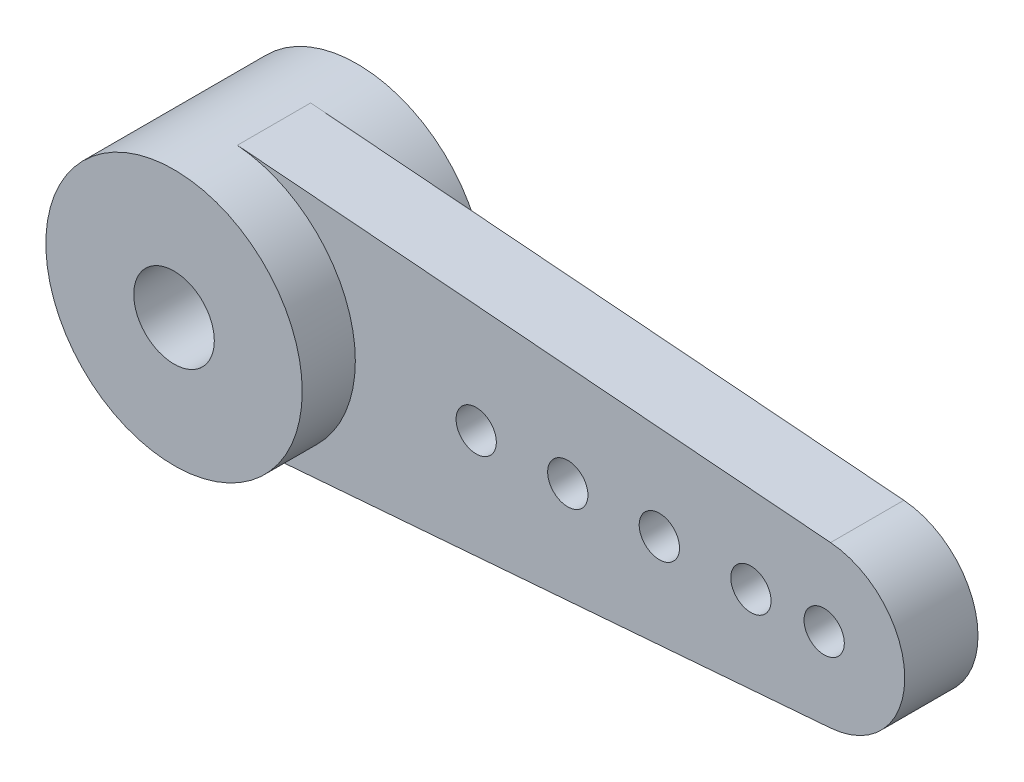
ISO-10303-21;
HEADER;
FILE_DESCRIPTION(('STEP AP214'),'2;1');
FILE_NAME('part.step','',(''),(''),'','','');
FILE_SCHEMA(('AUTOMOTIVE_DESIGN { 1 0 10303 214 1 1 1 1 }'));
ENDSEC;
DATA;
#1=APPLICATION_CONTEXT('core data for automotive mechanical design processes');
#2=APPLICATION_PROTOCOL_DEFINITION('international standard','automotive_design',2000,#1);
#3=PRODUCT_CONTEXT('',#1,'mechanical');
#4=PRODUCT('Part','Part','',(#3));
#5=PRODUCT_RELATED_PRODUCT_CATEGORY('part','',(#4));
#6=PRODUCT_DEFINITION_FORMATION('','',#4);
#7=PRODUCT_DEFINITION_CONTEXT('part definition',#1,'design');
#8=PRODUCT_DEFINITION('design','',#6,#7);
#9=PRODUCT_DEFINITION_SHAPE('','',#8);
#10=(LENGTH_UNIT() NAMED_UNIT(*) SI_UNIT(.MILLI.,.METRE.));
#11=(NAMED_UNIT(*) PLANE_ANGLE_UNIT() SI_UNIT($,.RADIAN.));
#12=(NAMED_UNIT(*) SI_UNIT($,.STERADIAN.) SOLID_ANGLE_UNIT());
#13=UNCERTAINTY_MEASURE_WITH_UNIT(LENGTH_MEASURE(1.E-05),#10,'distance_accuracy_value','');
#14=(GEOMETRIC_REPRESENTATION_CONTEXT(3) GLOBAL_UNCERTAINTY_ASSIGNED_CONTEXT((#13)) GLOBAL_UNIT_ASSIGNED_CONTEXT((#10,
#11,#12)) REPRESENTATION_CONTEXT('',''));
#15=CARTESIAN_POINT('',(0.,0.,0.));
#16=DIRECTION('',(0.,0.,1.));
#17=DIRECTION('',(1.,0.,0.));
#18=AXIS2_PLACEMENT_3D('',#15,#16,#17);
#19=CARTESIAN_POINT('',(0.,0.,27.8));
#20=DIRECTION('',(0.,0.,1.));
#21=DIRECTION('',(1.,0.,0.));
#22=AXIS2_PLACEMENT_3D('',#19,#20,#21);
#23=CYLINDRICAL_SURFACE('',#22,1.1);
#24=CARTESIAN_POINT('',(0.,0.,33.3));
#25=DIRECTION('',(0.,0.,1.));
#26=DIRECTION('',(1.,0.,0.));
#27=AXIS2_PLACEMENT_3D('',#24,#25,#26);
#28=CIRCLE('',#27,1.1);
#29=CARTESIAN_POINT('',(1.1,0.,33.3));
#30=VERTEX_POINT('',#29);
#31=EDGE_CURVE('E10',#30,#30,#28,.T.);
#32=ORIENTED_EDGE('',*,*,#31,.T.);
#33=EDGE_LOOP('',(#32));
#34=FACE_BOUND('',#33,.T.);
#35=CARTESIAN_POINT('',(0.,0.,28.3));
#36=DIRECTION('',(0.,0.,1.));
#37=DIRECTION('',(1.,0.,0.));
#38=AXIS2_PLACEMENT_3D('',#35,#36,#37);
#39=CIRCLE('',#38,1.1);
#40=CARTESIAN_POINT('',(1.1,0.,28.3));
#41=VERTEX_POINT('',#40);
#42=EDGE_CURVE('E125',#41,#41,#39,.T.);
#43=ORIENTED_EDGE('',*,*,#42,.F.);
#44=EDGE_LOOP('',(#43));
#45=FACE_BOUND('',#44,.T.);
#46=ADVANCED_FACE('F16',(#34,#45),#23,.F.);
#47=CARTESIAN_POINT('',(16.3,0.,29.35));
#48=DIRECTION('',(0.,0.,-1.));
#49=DIRECTION('',(1.,0.,0.));
#50=AXIS2_PLACEMENT_3D('',#47,#48,#49);
#51=CYLINDRICAL_SURFACE('',#50,0.55);
#52=CARTESIAN_POINT('',(16.3,0.,31.85));
#53=DIRECTION('',(0.,0.,-1.));
#54=DIRECTION('',(1.,0.,0.));
#55=AXIS2_PLACEMENT_3D('',#52,#53,#54);
#56=CIRCLE('',#55,0.55);
#57=CARTESIAN_POINT('',(16.85,0.,31.85));
#58=VERTEX_POINT('',#57);
#59=EDGE_CURVE('E88',#58,#58,#56,.T.);
#60=ORIENTED_EDGE('',*,*,#59,.F.);
#61=EDGE_LOOP('',(#60));
#62=FACE_BOUND('',#61,.T.);
#63=CARTESIAN_POINT('',(16.3,0.,29.85));
#64=DIRECTION('',(0.,0.,-1.));
#65=DIRECTION('',(1.,0.,0.));
#66=AXIS2_PLACEMENT_3D('',#63,#64,#65);
#67=CIRCLE('',#66,0.55);
#68=CARTESIAN_POINT('',(16.85,0.,29.85));
#69=VERTEX_POINT('',#68);
#70=EDGE_CURVE('E172',#69,#69,#67,.T.);
#71=ORIENTED_EDGE('',*,*,#70,.T.);
#72=EDGE_LOOP('',(#71));
#73=FACE_BOUND('',#72,.T.);
#74=ADVANCED_FACE('F185',(#62,#73),#51,.F.);
#75=CARTESIAN_POINT('',(14.3,0.,29.35));
#76=DIRECTION('',(0.,0.,-1.));
#77=DIRECTION('',(1.,0.,0.));
#78=AXIS2_PLACEMENT_3D('',#75,#76,#77);
#79=CYLINDRICAL_SURFACE('',#78,0.55);
#80=CARTESIAN_POINT('',(14.3,0.,31.85));
#81=DIRECTION('',(0.,0.,-1.));
#82=DIRECTION('',(1.,0.,0.));
#83=AXIS2_PLACEMENT_3D('',#80,#81,#82);
#84=CIRCLE('',#83,0.55);
#85=CARTESIAN_POINT('',(14.85,0.,31.85));
#86=VERTEX_POINT('',#85);
#87=EDGE_CURVE('E116',#86,#86,#84,.T.);
#88=ORIENTED_EDGE('',*,*,#87,.F.);
#89=EDGE_LOOP('',(#88));
#90=FACE_BOUND('',#89,.T.);
#91=CARTESIAN_POINT('',(14.3,0.,29.85));
#92=DIRECTION('',(0.,0.,-1.));
#93=DIRECTION('',(1.,0.,0.));
#94=AXIS2_PLACEMENT_3D('',#91,#92,#93);
#95=CIRCLE('',#94,0.55);
#96=CARTESIAN_POINT('',(14.85,0.,29.85));
#97=VERTEX_POINT('',#96);
#98=EDGE_CURVE('E143',#97,#97,#95,.T.);
#99=ORIENTED_EDGE('',*,*,#98,.T.);
#100=EDGE_LOOP('',(#99));
#101=FACE_BOUND('',#100,.T.);
#102=ADVANCED_FACE('F192',(#90,#101),#79,.F.);
#103=CARTESIAN_POINT('',(11.8,0.,29.35));
#104=DIRECTION('',(0.,0.,-1.));
#105=DIRECTION('',(1.,0.,0.));
#106=AXIS2_PLACEMENT_3D('',#103,#104,#105);
#107=CYLINDRICAL_SURFACE('',#106,0.55);
#108=CARTESIAN_POINT('',(11.8,0.,31.85));
#109=DIRECTION('',(0.,0.,-1.));
#110=DIRECTION('',(1.,0.,0.));
#111=AXIS2_PLACEMENT_3D('',#108,#109,#110);
#112=CIRCLE('',#111,0.55);
#113=CARTESIAN_POINT('',(12.35,0.,31.85));
#114=VERTEX_POINT('',#113);
#115=EDGE_CURVE('E113',#114,#114,#112,.T.);
#116=ORIENTED_EDGE('',*,*,#115,.F.);
#117=EDGE_LOOP('',(#116));
#118=FACE_BOUND('',#117,.T.);
#119=CARTESIAN_POINT('',(11.8,0.,29.85));
#120=DIRECTION('',(0.,0.,-1.));
#121=DIRECTION('',(1.,0.,0.));
#122=AXIS2_PLACEMENT_3D('',#119,#120,#121);
#123=CIRCLE('',#122,0.55);
#124=CARTESIAN_POINT('',(12.35,0.,29.85));
#125=VERTEX_POINT('',#124);
#126=EDGE_CURVE('E139',#125,#125,#123,.T.);
#127=ORIENTED_EDGE('',*,*,#126,.T.);
#128=EDGE_LOOP('',(#127));
#129=FACE_BOUND('',#128,.T.);
#130=ADVANCED_FACE('F222',(#118,#129),#107,.F.);
#131=CARTESIAN_POINT('',(9.3,0.,29.35));
#132=DIRECTION('',(0.,0.,-1.));
#133=DIRECTION('',(1.,0.,0.));
#134=AXIS2_PLACEMENT_3D('',#131,#132,#133);
#135=CYLINDRICAL_SURFACE('',#134,0.55);
#136=CARTESIAN_POINT('',(9.3,0.,31.85));
#137=DIRECTION('',(0.,0.,-1.));
#138=DIRECTION('',(1.,0.,0.));
#139=AXIS2_PLACEMENT_3D('',#136,#137,#138);
#140=CIRCLE('',#139,0.55);
#141=CARTESIAN_POINT('',(9.85,0.,31.85));
#142=VERTEX_POINT('',#141);
#143=EDGE_CURVE('E117',#142,#142,#140,.T.);
#144=ORIENTED_EDGE('',*,*,#143,.F.);
#145=EDGE_LOOP('',(#144));
#146=FACE_BOUND('',#145,.T.);
#147=CARTESIAN_POINT('',(9.3,0.,29.85));
#148=DIRECTION('',(0.,0.,-1.));
#149=DIRECTION('',(1.,0.,0.));
#150=AXIS2_PLACEMENT_3D('',#147,#148,#149);
#151=CIRCLE('',#150,0.55);
#152=CARTESIAN_POINT('',(9.85,0.,29.85));
#153=VERTEX_POINT('',#152);
#154=EDGE_CURVE('E144',#153,#153,#151,.T.);
#155=ORIENTED_EDGE('',*,*,#154,.T.);
#156=EDGE_LOOP('',(#155));
#157=FACE_BOUND('',#156,.T.);
#158=ADVANCED_FACE('F231',(#146,#157),#135,.F.);
#159=CARTESIAN_POINT('',(6.8,0.,29.35));
#160=DIRECTION('',(0.,0.,-1.));
#161=DIRECTION('',(1.,0.,0.));
#162=AXIS2_PLACEMENT_3D('',#159,#160,#161);
#163=CYLINDRICAL_SURFACE('',#162,0.55);
#164=CARTESIAN_POINT('',(6.8,0.,31.85));
#165=DIRECTION('',(0.,0.,-1.));
#166=DIRECTION('',(1.,0.,0.));
#167=AXIS2_PLACEMENT_3D('',#164,#165,#166);
#168=CIRCLE('',#167,0.55);
#169=CARTESIAN_POINT('',(7.35,0.,31.85));
#170=VERTEX_POINT('',#169);
#171=EDGE_CURVE('E138',#170,#170,#168,.T.);
#172=ORIENTED_EDGE('',*,*,#171,.F.);
#173=EDGE_LOOP('',(#172));
#174=FACE_BOUND('',#173,.T.);
#175=CARTESIAN_POINT('',(6.8,0.,29.85));
#176=DIRECTION('',(0.,0.,-1.));
#177=DIRECTION('',(1.,0.,0.));
#178=AXIS2_PLACEMENT_3D('',#175,#176,#177);
#179=CIRCLE('',#178,0.55);
#180=CARTESIAN_POINT('',(7.35,0.,29.85));
#181=VERTEX_POINT('',#180);
#182=EDGE_CURVE('E153',#181,#181,#179,.T.);
#183=ORIENTED_EDGE('',*,*,#182,.T.);
#184=EDGE_LOOP('',(#183));
#185=FACE_BOUND('',#184,.T.);
#186=ADVANCED_FACE('F234',(#174,#185),#163,.F.);
#187=CARTESIAN_POINT('',(16.3,0.,29.85));
#188=DIRECTION('',(0.,0.,-1.));
#189=DIRECTION('',(0.0797546012270053,-0.996814528176191,0.));
#190=AXIS2_PLACEMENT_3D('',#187,#188,#189);
#191=CYLINDRICAL_SURFACE('',#190,2.2);
#192=CARTESIAN_POINT('',(16.3,0.,29.85));
#193=DIRECTION('',(0.,0.,1.));
#194=DIRECTION('',(0.0797546012270053,-0.996814528176191,0.));
#195=AXIS2_PLACEMENT_3D('',#192,#193,#194);
#196=CIRCLE('',#195,2.2);
#197=CARTESIAN_POINT('',(16.475460122699,-2.192991961988,29.85));
#198=VERTEX_POINT('',#197);
#199=CARTESIAN_POINT('',(16.475460122699,2.192991961988,29.85));
#200=VERTEX_POINT('',#199);
#201=EDGE_CURVE('E45',#198,#200,#196,.T.);
#202=ORIENTED_EDGE('',*,*,#201,.T.);
#203=DIRECTION('',(0.,0.,1.));
#204=VECTOR('',#203,1.);
#205=CARTESIAN_POINT('',(16.475460122699,2.192991961988,29.85));
#206=LINE('',#205,#204);
#207=CARTESIAN_POINT('',(16.475460122699,2.192991961988,31.85));
#208=VERTEX_POINT('',#207);
#209=EDGE_CURVE('E58',#200,#208,#206,.T.);
#210=ORIENTED_EDGE('',*,*,#209,.T.);
#211=CARTESIAN_POINT('',(16.3,0.,31.85));
#212=DIRECTION('',(0.,0.,1.));
#213=DIRECTION('',(0.0797546012270053,-0.996814528176191,0.));
#214=AXIS2_PLACEMENT_3D('',#211,#212,#213);
#215=CIRCLE('',#214,2.2);
#216=CARTESIAN_POINT('',(16.475460122699,-2.192991961988,31.85));
#217=VERTEX_POINT('',#216);
#218=EDGE_CURVE('E147',#217,#208,#215,.T.);
#219=ORIENTED_EDGE('',*,*,#218,.F.);
#220=DIRECTION('',(0.,0.,1.));
#221=VECTOR('',#220,1.);
#222=CARTESIAN_POINT('',(16.475460122699,-2.192991961988,29.85));
#223=LINE('',#222,#221);
#224=EDGE_CURVE('E24',#198,#217,#223,.T.);
#225=ORIENTED_EDGE('',*,*,#224,.F.);
#226=EDGE_LOOP('',(#202,#210,#219,#225));
#227=FACE_BOUND('',#226,.T.);
#228=ADVANCED_FACE('F200',(#227),#191,.T.);
#229=CARTESIAN_POINT('',(0.,0.,33.3));
#230=DIRECTION('',(0.,0.,1.));
#231=DIRECTION('',(1.,0.,0.));
#232=AXIS2_PLACEMENT_3D('',#229,#230,#231);
#233=PLANE('',#232);
#234=ORIENTED_EDGE('',*,*,#31,.F.);
#235=EDGE_LOOP('',(#234));
#236=FACE_BOUND('',#235,.T.);
#237=CARTESIAN_POINT('',(0.,0.,33.3));
#238=DIRECTION('',(0.,0.,1.));
#239=DIRECTION('',(1.,0.,0.));
#240=AXIS2_PLACEMENT_3D('',#237,#238,#239);
#241=CIRCLE('',#240,3.5);
#242=CARTESIAN_POINT('',(3.5,0.,33.3));
#243=VERTEX_POINT('',#242);
#244=EDGE_CURVE('E126',#243,#243,#241,.T.);
#245=ORIENTED_EDGE('',*,*,#244,.T.);
#246=EDGE_LOOP('',(#245));
#247=FACE_BOUND('',#246,.T.);
#248=ADVANCED_FACE('F196',(#236,#247),#233,.T.);
#249=CARTESIAN_POINT('',(0.279141104294,-3.488850848617,29.85));
#250=DIRECTION('',(-0.0797546012270053,0.996814528176191,0.));
#251=DIRECTION('',(0.,0.,1.));
#252=AXIS2_PLACEMENT_3D('',#249,#250,#251);
#253=PLANE('',#252);
#254=DIRECTION('',(0.996814528176191,0.0797546012270053,0.));
#255=VECTOR('',#254,1.);
#256=CARTESIAN_POINT('',(0.279141104294,-3.488850848617,29.85));
#257=LINE('',#256,#255);
#258=CARTESIAN_POINT('',(0.279141104294,-3.488850848617,29.85));
#259=VERTEX_POINT('',#258);
#260=EDGE_CURVE('E93',#259,#198,#257,.T.);
#261=ORIENTED_EDGE('',*,*,#260,.T.);
#262=ORIENTED_EDGE('',*,*,#224,.T.);
#263=DIRECTION('',(0.996814528176191,0.0797546012270053,0.));
#264=VECTOR('',#263,1.);
#265=CARTESIAN_POINT('',(0.279141104294,-3.488850848617,31.85));
#266=LINE('',#265,#264);
#267=CARTESIAN_POINT('',(0.279141104294,-3.488850848617,31.85));
#268=VERTEX_POINT('',#267);
#269=EDGE_CURVE('E134',#268,#217,#266,.T.);
#270=ORIENTED_EDGE('',*,*,#269,.F.);
#271=DIRECTION('',(0.,0.,1.));
#272=VECTOR('',#271,1.);
#273=CARTESIAN_POINT('',(0.279141104294,-3.488850848617,29.85));
#274=LINE('',#273,#272);
#275=EDGE_CURVE('E122',#259,#268,#274,.T.);
#276=ORIENTED_EDGE('',*,*,#275,.F.);
#277=EDGE_LOOP('',(#261,#262,#270,#276));
#278=FACE_BOUND('',#277,.T.);
#279=ADVANCED_FACE('F199',(#278),#253,.F.);
#280=CARTESIAN_POINT('',(0.,0.,28.3));
#281=DIRECTION('',(0.,0.,1.));
#282=DIRECTION('',(1.,0.,0.));
#283=AXIS2_PLACEMENT_3D('',#280,#281,#282);
#284=PLANE('',#283);
#285=ORIENTED_EDGE('',*,*,#42,.T.);
#286=EDGE_LOOP('',(#285));
#287=FACE_BOUND('',#286,.T.);
#288=CARTESIAN_POINT('',(0.,0.,28.3));
#289=DIRECTION('',(0.,0.,1.));
#290=DIRECTION('',(1.,0.,0.));
#291=AXIS2_PLACEMENT_3D('',#288,#289,#290);
#292=CIRCLE('',#291,3.5);
#293=CARTESIAN_POINT('',(3.5,0.,28.3));
#294=VERTEX_POINT('',#293);
#295=EDGE_CURVE('E98',#294,#294,#292,.T.);
#296=ORIENTED_EDGE('',*,*,#295,.F.);
#297=EDGE_LOOP('',(#296));
#298=FACE_BOUND('',#297,.T.);
#299=ADVANCED_FACE('F181',(#287,#298),#284,.F.);
#300=CARTESIAN_POINT('',(7.283080995368,0.,29.85));
#301=DIRECTION('',(0.,0.,1.));
#302=DIRECTION('',(1.,0.,0.));
#303=AXIS2_PLACEMENT_3D('',#300,#301,#302);
#304=PLANE('',#303);
#305=ORIENTED_EDGE('',*,*,#70,.F.);
#306=EDGE_LOOP('',(#305));
#307=FACE_BOUND('',#306,.T.);
#308=ORIENTED_EDGE('',*,*,#98,.F.);
#309=EDGE_LOOP('',(#308));
#310=FACE_BOUND('',#309,.T.);
#311=ORIENTED_EDGE('',*,*,#126,.F.);
#312=EDGE_LOOP('',(#311));
#313=FACE_BOUND('',#312,.T.);
#314=ORIENTED_EDGE('',*,*,#154,.F.);
#315=EDGE_LOOP('',(#314));
#316=FACE_BOUND('',#315,.T.);
#317=ORIENTED_EDGE('',*,*,#182,.F.);
#318=EDGE_LOOP('',(#317));
#319=FACE_BOUND('',#318,.T.);
#320=ORIENTED_EDGE('',*,*,#201,.F.);
#321=ORIENTED_EDGE('',*,*,#260,.F.);
#322=CARTESIAN_POINT('',(0.,0.,29.85));
#323=DIRECTION('',(0.,0.,1.));
#324=DIRECTION('',(1.,0.,0.));
#325=AXIS2_PLACEMENT_3D('',#322,#323,#324);
#326=CIRCLE('',#325,3.5);
#327=CARTESIAN_POINT('',(0.279141104294,3.488850848617,29.85));
#328=VERTEX_POINT('',#327);
#329=EDGE_CURVE('E91',#259,#328,#326,.T.);
#330=ORIENTED_EDGE('',*,*,#329,.T.);
#331=DIRECTION('',(-0.996814528176191,0.0797546012270053,0.));
#332=VECTOR('',#331,1.);
#333=CARTESIAN_POINT('',(16.475460122699,2.192991961988,29.85));
#334=LINE('',#333,#332);
#335=EDGE_CURVE('E81',#200,#328,#334,.T.);
#336=ORIENTED_EDGE('',*,*,#335,.F.);
#337=EDGE_LOOP('',(#320,#321,#330,#336));
#338=FACE_BOUND('',#337,.T.);
#339=ADVANCED_FACE('F92',(#307,#310,#313,#316,#319,#338),#304,.F.);
#340=CARTESIAN_POINT('',(16.475460122699,2.192991961988,29.85));
#341=DIRECTION('',(-0.0797546012270053,-0.996814528176191,0.));
#342=DIRECTION('',(-0.996814528176191,0.0797546012270053,0.));
#343=AXIS2_PLACEMENT_3D('',#340,#341,#342);
#344=PLANE('',#343);
#345=ORIENTED_EDGE('',*,*,#335,.T.);
#346=DIRECTION('',(0.,0.,1.));
#347=VECTOR('',#346,1.);
#348=CARTESIAN_POINT('',(0.279141104294,3.488850848617,29.85));
#349=LINE('',#348,#347);
#350=CARTESIAN_POINT('',(0.279141104294,3.488850848617,31.85));
#351=VERTEX_POINT('',#350);
#352=EDGE_CURVE('E85',#328,#351,#349,.T.);
#353=ORIENTED_EDGE('',*,*,#352,.T.);
#354=DIRECTION('',(-0.996814528176191,0.0797546012270053,0.));
#355=VECTOR('',#354,1.);
#356=CARTESIAN_POINT('',(16.475460122699,2.192991961988,31.85));
#357=LINE('',#356,#355);
#358=EDGE_CURVE('E75',#208,#351,#357,.T.);
#359=ORIENTED_EDGE('',*,*,#358,.F.);
#360=ORIENTED_EDGE('',*,*,#209,.F.);
#361=EDGE_LOOP('',(#345,#353,#359,#360));
#362=FACE_BOUND('',#361,.T.);
#363=ADVANCED_FACE('F83',(#362),#344,.F.);
#364=CARTESIAN_POINT('',(7.283080995368,0.,31.85));
#365=DIRECTION('',(0.,0.,1.));
#366=DIRECTION('',(1.,0.,0.));
#367=AXIS2_PLACEMENT_3D('',#364,#365,#366);
#368=PLANE('',#367);
#369=ORIENTED_EDGE('',*,*,#59,.T.);
#370=EDGE_LOOP('',(#369));
#371=FACE_BOUND('',#370,.T.);
#372=ORIENTED_EDGE('',*,*,#87,.T.);
#373=EDGE_LOOP('',(#372));
#374=FACE_BOUND('',#373,.T.);
#375=ORIENTED_EDGE('',*,*,#115,.T.);
#376=EDGE_LOOP('',(#375));
#377=FACE_BOUND('',#376,.T.);
#378=ORIENTED_EDGE('',*,*,#143,.T.);
#379=EDGE_LOOP('',(#378));
#380=FACE_BOUND('',#379,.T.);
#381=ORIENTED_EDGE('',*,*,#171,.T.);
#382=EDGE_LOOP('',(#381));
#383=FACE_BOUND('',#382,.T.);
#384=ORIENTED_EDGE('',*,*,#358,.T.);
#385=CARTESIAN_POINT('',(0.,0.,31.85));
#386=DIRECTION('',(0.,0.,1.));
#387=DIRECTION('',(1.,0.,0.));
#388=AXIS2_PLACEMENT_3D('',#385,#386,#387);
#389=CIRCLE('',#388,3.5);
#390=EDGE_CURVE('E68',#268,#351,#389,.T.);
#391=ORIENTED_EDGE('',*,*,#390,.F.);
#392=ORIENTED_EDGE('',*,*,#269,.T.);
#393=ORIENTED_EDGE('',*,*,#218,.T.);
#394=EDGE_LOOP('',(#384,#391,#392,#393));
#395=FACE_BOUND('',#394,.T.);
#396=ADVANCED_FACE('F205',(#371,#374,#377,#380,#383,#395),#368,.T.);
#397=CARTESIAN_POINT('',(0.,0.,28.3));
#398=DIRECTION('',(0.,0.,1.));
#399=DIRECTION('',(1.,0.,0.));
#400=AXIS2_PLACEMENT_3D('',#397,#398,#399);
#401=CYLINDRICAL_SURFACE('',#400,3.5);
#402=ORIENTED_EDGE('',*,*,#329,.F.);
#403=ORIENTED_EDGE('',*,*,#275,.T.);
#404=ORIENTED_EDGE('',*,*,#390,.T.);
#405=ORIENTED_EDGE('',*,*,#352,.F.);
#406=EDGE_LOOP('',(#402,#403,#404,#405));
#407=FACE_BOUND('',#406,.T.);
#408=ORIENTED_EDGE('',*,*,#244,.F.);
#409=EDGE_LOOP('',(#408));
#410=FACE_BOUND('',#409,.T.);
#411=ORIENTED_EDGE('',*,*,#295,.T.);
#412=EDGE_LOOP('',(#411));
#413=FACE_BOUND('',#412,.T.);
#414=ADVANCED_FACE('F100',(#407,#410,#413),#401,.T.);
#415=CLOSED_SHELL('',(#46,#74,#102,#130,#158,#186,#228,#248,#279,#299,#339,#363,#396,#414));
#416=MANIFOLD_SOLID_BREP('B1',#415);
#417=ADVANCED_BREP_SHAPE_REPRESENTATION('',(#18,#416),#14);
#418=SHAPE_DEFINITION_REPRESENTATION(#9,#417);
ENDSEC;
END-ISO-10303-21;
